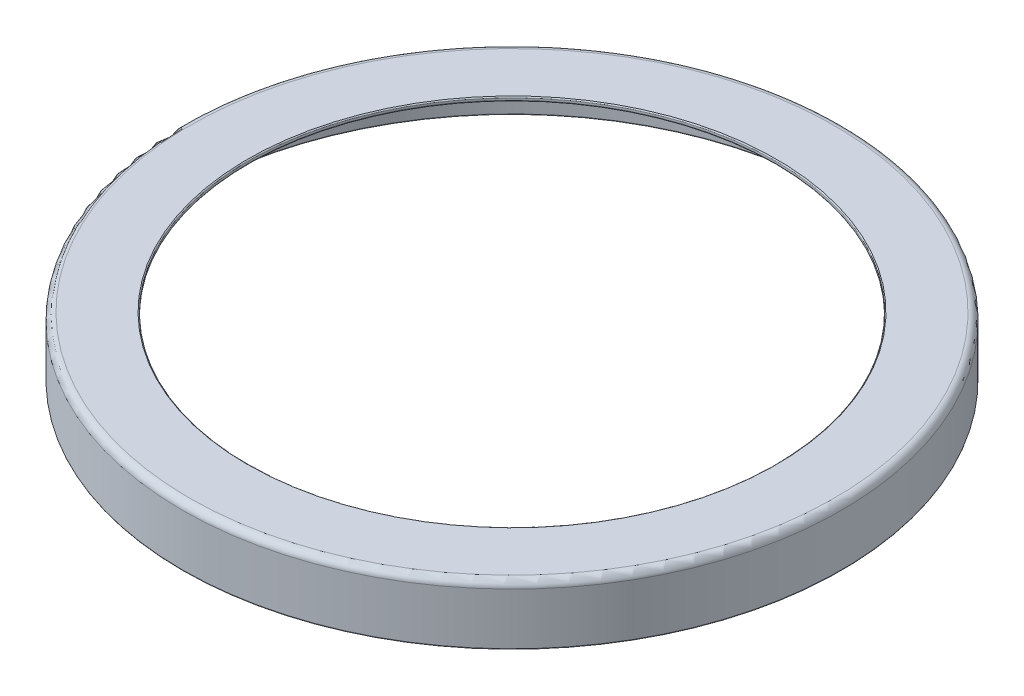
ISO-10303-21;
HEADER;
FILE_DESCRIPTION(('STEP AP214'),'2;1');
FILE_NAME('part.step','',(''),(''),'','','');
FILE_SCHEMA(('AUTOMOTIVE_DESIGN { 1 0 10303 214 1 1 1 1 }'));
ENDSEC;
DATA;
#1=APPLICATION_CONTEXT('core data for automotive mechanical design processes');
#2=APPLICATION_PROTOCOL_DEFINITION('international standard','automotive_design',2000,#1);
#3=PRODUCT_CONTEXT('',#1,'mechanical');
#4=PRODUCT('Part','Part','',(#3));
#5=PRODUCT_RELATED_PRODUCT_CATEGORY('part','',(#4));
#6=PRODUCT_DEFINITION_FORMATION('','',#4);
#7=PRODUCT_DEFINITION_CONTEXT('part definition',#1,'design');
#8=PRODUCT_DEFINITION('design','',#6,#7);
#9=PRODUCT_DEFINITION_SHAPE('','',#8);
#10=(LENGTH_UNIT() NAMED_UNIT(*) SI_UNIT(.MILLI.,.METRE.));
#11=(NAMED_UNIT(*) PLANE_ANGLE_UNIT() SI_UNIT($,.RADIAN.));
#12=(NAMED_UNIT(*) SI_UNIT($,.STERADIAN.) SOLID_ANGLE_UNIT());
#13=UNCERTAINTY_MEASURE_WITH_UNIT(LENGTH_MEASURE(1.E-05),#10,'distance_accuracy_value','');
#14=(GEOMETRIC_REPRESENTATION_CONTEXT(3) GLOBAL_UNCERTAINTY_ASSIGNED_CONTEXT((#13)) GLOBAL_UNIT_ASSIGNED_CONTEXT((#10,
#11,#12)) REPRESENTATION_CONTEXT('',''));
#15=CARTESIAN_POINT('',(0.,0.,0.));
#16=DIRECTION('',(0.,0.,1.));
#17=DIRECTION('',(1.,0.,0.));
#18=AXIS2_PLACEMENT_3D('',#15,#16,#17);
#19=CARTESIAN_POINT('',(80.5,28.5714839424142,0.));
#20=DIRECTION('',(0.,-1.,0.));
#21=DIRECTION('',(0.,0.,-1.));
#22=AXIS2_PLACEMENT_3D('',#19,#20,#21);
#23=PLANE('',#22);
#24=CARTESIAN_POINT('',(0.,28.5714839424142,0.));
#25=DIRECTION('',(0.,-1.,0.));
#26=DIRECTION('',(0.,0.,-1.));
#27=AXIS2_PLACEMENT_3D('',#24,#25,#26);
#28=CIRCLE('',#27,65.4);
#29=CARTESIAN_POINT('',(0.,28.5714839424142,-65.4));
#30=VERTEX_POINT('',#29);
#31=EDGE_CURVE('E38',#30,#30,#28,.F.);
#32=ORIENTED_EDGE('',*,*,#31,.T.);
#33=EDGE_LOOP('',(#32));
#34=FACE_BOUND('',#33,.T.);
#35=CARTESIAN_POINT('',(0.,28.5714839424142,0.));
#36=DIRECTION('',(0.,-1.,0.));
#37=DIRECTION('',(0.,0.,-1.));
#38=AXIS2_PLACEMENT_3D('',#35,#36,#37);
#39=CIRCLE('',#38,80.);
#40=CARTESIAN_POINT('',(0.,28.5714839424142,-80.));
#41=VERTEX_POINT('',#40);
#42=EDGE_CURVE('E66',#41,#41,#39,.T.);
#43=ORIENTED_EDGE('',*,*,#42,.T.);
#44=EDGE_LOOP('',(#43));
#45=FACE_BOUND('',#44,.T.);
#46=ADVANCED_FACE('F31',(#34,#45),#23,.T.);
#47=CARTESIAN_POINT('',(0.,-73.0425802879291,0.));
#48=DIRECTION('',(0.,-1.,0.));
#49=DIRECTION('',(0.,0.,-1.));
#50=AXIS2_PLACEMENT_3D('',#47,#48,#49);
#51=CYLINDRICAL_SURFACE('',#50,65.15);
#52=CARTESIAN_POINT('',(0.,28.8214839424142,0.));
#53=DIRECTION('',(0.,-1.,0.));
#54=DIRECTION('',(0.,0.,-1.));
#55=AXIS2_PLACEMENT_3D('',#52,#53,#54);
#56=CIRCLE('',#55,65.15);
#57=CARTESIAN_POINT('',(0.,28.8214839424142,-65.15));
#58=VERTEX_POINT('',#57);
#59=EDGE_CURVE('E42',#58,#58,#56,.T.);
#60=ORIENTED_EDGE('',*,*,#59,.T.);
#61=EDGE_LOOP('',(#60));
#62=FACE_BOUND('',#61,.T.);
#63=CARTESIAN_POINT('',(0.,29.3214839424142,0.));
#64=DIRECTION('',(0.,1.,0.));
#65=DIRECTION('',(0.,0.,1.));
#66=AXIS2_PLACEMENT_3D('',#63,#64,#65);
#67=CIRCLE('',#66,65.15);
#68=CARTESIAN_POINT('',(0.,29.3214839424142,65.15));
#69=VERTEX_POINT('',#68);
#70=EDGE_CURVE('E46',#69,#69,#67,.T.);
#71=ORIENTED_EDGE('',*,*,#70,.T.);
#72=EDGE_LOOP('',(#71));
#73=FACE_BOUND('',#72,.T.);
#74=ADVANCED_FACE('F97',(#62,#73),#51,.F.);
#75=CARTESIAN_POINT('',(65.15,29.5714839424142,0.));
#76=DIRECTION('',(0.,1.,0.));
#77=DIRECTION('',(0.,0.,1.));
#78=AXIS2_PLACEMENT_3D('',#75,#76,#77);
#79=PLANE('',#78);
#80=CARTESIAN_POINT('',(0.,29.5714839424142,0.));
#81=DIRECTION('',(0.,1.,0.));
#82=DIRECTION('',(0.,0.,1.));
#83=AXIS2_PLACEMENT_3D('',#80,#81,#82);
#84=CIRCLE('',#83,65.4);
#85=CARTESIAN_POINT('',(0.,29.5714839424142,65.4));
#86=VERTEX_POINT('',#85);
#87=EDGE_CURVE('E10',#86,#86,#84,.F.);
#88=ORIENTED_EDGE('',*,*,#87,.T.);
#89=EDGE_LOOP('',(#88));
#90=FACE_BOUND('',#89,.T.);
#91=CARTESIAN_POINT('',(0.,29.5714839424142,0.));
#92=DIRECTION('',(0.,1.,0.));
#93=DIRECTION('',(0.,0.,1.));
#94=AXIS2_PLACEMENT_3D('',#91,#92,#93);
#95=CIRCLE('',#94,79.75);
#96=CARTESIAN_POINT('',(0.,29.5714839424142,79.75));
#97=VERTEX_POINT('',#96);
#98=EDGE_CURVE('E69',#97,#97,#95,.T.);
#99=ORIENTED_EDGE('',*,*,#98,.T.);
#100=EDGE_LOOP('',(#99));
#101=FACE_BOUND('',#100,.T.);
#102=ADVANCED_FACE('F101',(#90,#101),#79,.T.);
#103=CARTESIAN_POINT('',(0.,-73.0425802879291,0.));
#104=DIRECTION('',(0.,-1.,0.));
#105=DIRECTION('',(0.,0.,-1.));
#106=AXIS2_PLACEMENT_3D('',#103,#104,#105);
#107=CYLINDRICAL_SURFACE('',#106,81.5);
#108=CARTESIAN_POINT('',(0.,15.0714839424142,0.));
#109=DIRECTION('',(0.,-1.,0.));
#110=DIRECTION('',(0.,0.,-1.));
#111=AXIS2_PLACEMENT_3D('',#108,#109,#110);
#112=CIRCLE('',#111,81.5);
#113=CARTESIAN_POINT('',(0.,15.0714839424142,-81.5));
#114=VERTEX_POINT('',#113);
#115=EDGE_CURVE('E54',#114,#114,#112,.F.);
#116=ORIENTED_EDGE('',*,*,#115,.T.);
#117=EDGE_LOOP('',(#116));
#118=FACE_BOUND('',#117,.T.);
#119=CARTESIAN_POINT('',(0.,27.8214839424142,0.));
#120=DIRECTION('',(0.,1.,0.));
#121=DIRECTION('',(0.,0.,1.));
#122=AXIS2_PLACEMENT_3D('',#119,#120,#121);
#123=CIRCLE('',#122,81.5);
#124=CARTESIAN_POINT('',(0.,27.8214839424142,81.5));
#125=VERTEX_POINT('',#124);
#126=EDGE_CURVE('E72',#125,#125,#123,.F.);
#127=ORIENTED_EDGE('',*,*,#126,.T.);
#128=EDGE_LOOP('',(#127));
#129=FACE_BOUND('',#128,.T.);
#130=ADVANCED_FACE('F76',(#118,#129),#107,.T.);
#131=CARTESIAN_POINT('',(81.5,14.8214839424142,0.));
#132=DIRECTION('',(0.,-1.,0.));
#133=DIRECTION('',(0.,0.,-1.));
#134=AXIS2_PLACEMENT_3D('',#131,#132,#133);
#135=PLANE('',#134);
#136=CARTESIAN_POINT('',(0.,14.8214839424142,0.));
#137=DIRECTION('',(0.,-1.,0.));
#138=DIRECTION('',(0.,0.,-1.));
#139=AXIS2_PLACEMENT_3D('',#136,#137,#138);
#140=CIRCLE('',#139,81.25);
#141=CARTESIAN_POINT('',(0.,14.8214839424142,-81.25));
#142=VERTEX_POINT('',#141);
#143=EDGE_CURVE('E57',#142,#142,#140,.T.);
#144=ORIENTED_EDGE('',*,*,#143,.T.);
#145=EDGE_LOOP('',(#144));
#146=FACE_BOUND('',#145,.T.);
#147=CARTESIAN_POINT('',(0.,14.8214839424142,0.));
#148=DIRECTION('',(0.,-1.,0.));
#149=DIRECTION('',(0.,0.,-1.));
#150=AXIS2_PLACEMENT_3D('',#147,#148,#149);
#151=CIRCLE('',#150,80.75);
#152=CARTESIAN_POINT('',(0.,14.8214839424142,-80.75));
#153=VERTEX_POINT('',#152);
#154=EDGE_CURVE('E60',#153,#153,#151,.F.);
#155=ORIENTED_EDGE('',*,*,#154,.T.);
#156=EDGE_LOOP('',(#155));
#157=FACE_BOUND('',#156,.T.);
#158=ADVANCED_FACE('F91',(#146,#157),#135,.T.);
#159=CARTESIAN_POINT('',(0.,-73.0425802879291,0.));
#160=DIRECTION('',(0.,-1.,0.));
#161=DIRECTION('',(0.,0.,-1.));
#162=AXIS2_PLACEMENT_3D('',#159,#160,#161);
#163=CYLINDRICAL_SURFACE('',#162,80.5);
#164=CARTESIAN_POINT('',(0.,15.0714839424142,0.));
#165=DIRECTION('',(0.,-1.,0.));
#166=DIRECTION('',(0.,0.,-1.));
#167=AXIS2_PLACEMENT_3D('',#164,#165,#166);
#168=CIRCLE('',#167,80.5);
#169=CARTESIAN_POINT('',(0.,15.0714839424142,-80.5));
#170=VERTEX_POINT('',#169);
#171=EDGE_CURVE('E51',#170,#170,#168,.T.);
#172=ORIENTED_EDGE('',*,*,#171,.T.);
#173=EDGE_LOOP('',(#172));
#174=FACE_BOUND('',#173,.T.);
#175=CARTESIAN_POINT('',(0.,28.0714839424142,0.));
#176=DIRECTION('',(0.,-1.,0.));
#177=DIRECTION('',(0.,0.,-1.));
#178=AXIS2_PLACEMENT_3D('',#175,#176,#177);
#179=CIRCLE('',#178,80.5);
#180=CARTESIAN_POINT('',(0.,28.0714839424142,-80.5));
#181=VERTEX_POINT('',#180);
#182=EDGE_CURVE('E63',#181,#181,#179,.F.);
#183=ORIENTED_EDGE('',*,*,#182,.T.);
#184=EDGE_LOOP('',(#183));
#185=FACE_BOUND('',#184,.T.);
#186=ADVANCED_FACE('F81',(#174,#185),#163,.F.);
#187=CARTESIAN_POINT('',(0.,27.8214839424142,0.));
#188=DIRECTION('',(0.,1.,0.));
#189=DIRECTION('',(0.,0.,1.));
#190=AXIS2_PLACEMENT_3D('',#187,#188,#189);
#191=TOROIDAL_SURFACE('',#190,79.75,1.75);
#192=ORIENTED_EDGE('',*,*,#98,.F.);
#193=EDGE_LOOP('',(#192));
#194=FACE_BOUND('',#193,.T.);
#195=ORIENTED_EDGE('',*,*,#126,.F.);
#196=EDGE_LOOP('',(#195));
#197=FACE_BOUND('',#196,.T.);
#198=ADVANCED_FACE('F78',(#194,#197),#191,.T.);
#199=CARTESIAN_POINT('',(0.,28.0714839424142,0.));
#200=DIRECTION('',(0.,-1.,0.));
#201=DIRECTION('',(0.,0.,-1.));
#202=AXIS2_PLACEMENT_3D('',#199,#200,#201);
#203=TOROIDAL_SURFACE('',#202,80.,0.5);
#204=ORIENTED_EDGE('',*,*,#182,.F.);
#205=EDGE_LOOP('',(#204));
#206=FACE_BOUND('',#205,.T.);
#207=ORIENTED_EDGE('',*,*,#42,.F.);
#208=EDGE_LOOP('',(#207));
#209=FACE_BOUND('',#208,.T.);
#210=ADVANCED_FACE('F80',(#206,#209),#203,.F.);
#211=CARTESIAN_POINT('',(0.,15.0714839424142,0.));
#212=DIRECTION('',(0.,-1.,0.));
#213=DIRECTION('',(0.,0.,-1.));
#214=AXIS2_PLACEMENT_3D('',#211,#212,#213);
#215=TOROIDAL_SURFACE('',#214,81.25,0.25);
#216=ORIENTED_EDGE('',*,*,#115,.F.);
#217=EDGE_LOOP('',(#216));
#218=FACE_BOUND('',#217,.T.);
#219=ORIENTED_EDGE('',*,*,#143,.F.);
#220=EDGE_LOOP('',(#219));
#221=FACE_BOUND('',#220,.T.);
#222=ADVANCED_FACE('F88',(#218,#221),#215,.T.);
#223=CARTESIAN_POINT('',(0.,15.0714839424142,0.));
#224=DIRECTION('',(0.,-1.,0.));
#225=DIRECTION('',(0.,0.,-1.));
#226=AXIS2_PLACEMENT_3D('',#223,#224,#225);
#227=TOROIDAL_SURFACE('',#226,80.75,0.25);
#228=ORIENTED_EDGE('',*,*,#154,.F.);
#229=EDGE_LOOP('',(#228));
#230=FACE_BOUND('',#229,.T.);
#231=ORIENTED_EDGE('',*,*,#171,.F.);
#232=EDGE_LOOP('',(#231));
#233=FACE_BOUND('',#232,.T.);
#234=ADVANCED_FACE('F119',(#230,#233),#227,.T.);
#235=CARTESIAN_POINT('',(0.,28.8214839424142,0.));
#236=DIRECTION('',(0.,-1.,0.));
#237=DIRECTION('',(0.,0.,-1.));
#238=AXIS2_PLACEMENT_3D('',#235,#236,#237);
#239=TOROIDAL_SURFACE('',#238,65.4,0.25);
#240=ORIENTED_EDGE('',*,*,#31,.F.);
#241=EDGE_LOOP('',(#240));
#242=FACE_BOUND('',#241,.T.);
#243=ORIENTED_EDGE('',*,*,#59,.F.);
#244=EDGE_LOOP('',(#243));
#245=FACE_BOUND('',#244,.T.);
#246=ADVANCED_FACE('F122',(#242,#245),#239,.T.);
#247=CARTESIAN_POINT('',(0.,29.3214839424142,0.));
#248=DIRECTION('',(0.,1.,0.));
#249=DIRECTION('',(0.,0.,1.));
#250=AXIS2_PLACEMENT_3D('',#247,#248,#249);
#251=TOROIDAL_SURFACE('',#250,65.4,0.25);
#252=ORIENTED_EDGE('',*,*,#70,.F.);
#253=EDGE_LOOP('',(#252));
#254=FACE_BOUND('',#253,.T.);
#255=ORIENTED_EDGE('',*,*,#87,.F.);
#256=EDGE_LOOP('',(#255));
#257=FACE_BOUND('',#256,.T.);
#258=ADVANCED_FACE('F33',(#254,#257),#251,.T.);
#259=CLOSED_SHELL('',(#46,#74,#102,#130,#158,#186,#198,#210,#222,#234,#246,#258));
#260=MANIFOLD_SOLID_BREP('B2',#259);
#261=ADVANCED_BREP_SHAPE_REPRESENTATION('',(#18,#260),#14);
#262=SHAPE_DEFINITION_REPRESENTATION(#9,#261);
ENDSEC;
END-ISO-10303-21;
